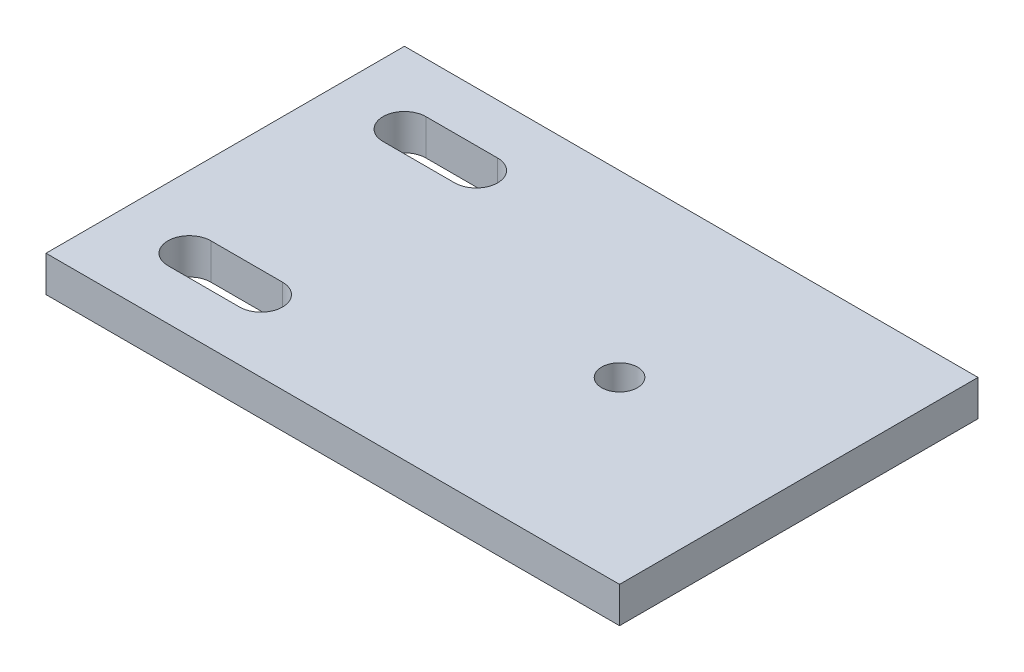
ISO-10303-21;
HEADER;
FILE_DESCRIPTION(('STEP AP214'),'2;1');
FILE_NAME('part.step','',(''),(''),'','','');
FILE_SCHEMA(('AUTOMOTIVE_DESIGN { 1 0 10303 214 1 1 1 1 }'));
ENDSEC;
DATA;
#1=APPLICATION_CONTEXT('core data for automotive mechanical design processes');
#2=APPLICATION_PROTOCOL_DEFINITION('international standard','automotive_design',2000,#1);
#3=PRODUCT_CONTEXT('',#1,'mechanical');
#4=PRODUCT('Part','Part','',(#3));
#5=PRODUCT_RELATED_PRODUCT_CATEGORY('part','',(#4));
#6=PRODUCT_DEFINITION_FORMATION('','',#4);
#7=PRODUCT_DEFINITION_CONTEXT('part definition',#1,'design');
#8=PRODUCT_DEFINITION('design','',#6,#7);
#9=PRODUCT_DEFINITION_SHAPE('','',#8);
#10=(LENGTH_UNIT() NAMED_UNIT(*) SI_UNIT(.MILLI.,.METRE.));
#11=(NAMED_UNIT(*) PLANE_ANGLE_UNIT() SI_UNIT($,.RADIAN.));
#12=(NAMED_UNIT(*) SI_UNIT($,.STERADIAN.) SOLID_ANGLE_UNIT());
#13=UNCERTAINTY_MEASURE_WITH_UNIT(LENGTH_MEASURE(1.E-05),#10,'distance_accuracy_value','');
#14=(GEOMETRIC_REPRESENTATION_CONTEXT(3) GLOBAL_UNCERTAINTY_ASSIGNED_CONTEXT((#13)) GLOBAL_UNIT_ASSIGNED_CONTEXT((#10,
#11,#12)) REPRESENTATION_CONTEXT('',''));
#15=CARTESIAN_POINT('',(0.,0.,0.));
#16=DIRECTION('',(0.,0.,1.));
#17=DIRECTION('',(1.,0.,0.));
#18=AXIS2_PLACEMENT_3D('',#15,#16,#17);
#19=CARTESIAN_POINT('',(0.,5.,0.));
#20=DIRECTION('',(0.,-1.,0.));
#21=DIRECTION('',(0.,0.,-1.));
#22=AXIS2_PLACEMENT_3D('',#19,#20,#21);
#23=PLANE('',#22);
#24=CARTESIAN_POINT('',(10.,5.,-40.));
#25=DIRECTION('',(0.,1.,0.));
#26=DIRECTION('',(0.,0.,1.));
#27=AXIS2_PLACEMENT_3D('',#24,#25,#26);
#28=CIRCLE('',#27,3.00000000000001);
#29=CARTESIAN_POINT('',(10.,5.,-43.));
#30=VERTEX_POINT('',#29);
#31=CARTESIAN_POINT('',(10.,5.,-37.));
#32=VERTEX_POINT('',#31);
#33=EDGE_CURVE('E163',#30,#32,#28,.T.);
#34=ORIENTED_EDGE('',*,*,#33,.F.);
#35=DIRECTION('',(-1.,0.,0.));
#36=VECTOR('',#35,1.);
#37=CARTESIAN_POINT('',(10.,5.,-43.));
#38=LINE('',#37,#36);
#39=CARTESIAN_POINT('',(20.,5.,-43.));
#40=VERTEX_POINT('',#39);
#41=EDGE_CURVE('E171',#40,#30,#38,.T.);
#42=ORIENTED_EDGE('',*,*,#41,.F.);
#43=CARTESIAN_POINT('',(20.,5.,-40.));
#44=DIRECTION('',(0.,1.,0.));
#45=DIRECTION('',(0.,0.,1.));
#46=AXIS2_PLACEMENT_3D('',#43,#44,#45);
#47=CIRCLE('',#46,3.00000000000001);
#48=CARTESIAN_POINT('',(20.,5.,-37.));
#49=VERTEX_POINT('',#48);
#50=EDGE_CURVE('E168',#49,#40,#47,.T.);
#51=ORIENTED_EDGE('',*,*,#50,.F.);
#52=DIRECTION('',(1.,0.,0.));
#53=VECTOR('',#52,1.);
#54=CARTESIAN_POINT('',(10.,5.,-37.));
#55=LINE('',#54,#53);
#56=EDGE_CURVE('E165',#32,#49,#55,.T.);
#57=ORIENTED_EDGE('',*,*,#56,.F.);
#58=EDGE_LOOP('',(#34,#42,#51,#57));
#59=FACE_BOUND('',#58,.T.);
#60=DIRECTION('',(0.,0.,1.));
#61=VECTOR('',#60,1.);
#62=CARTESIAN_POINT('',(0.,5.,0.));
#63=LINE('',#62,#61);
#64=CARTESIAN_POINT('',(0.,5.,-50.));
#65=VERTEX_POINT('',#64);
#66=CARTESIAN_POINT('',(0.,5.,0.));
#67=VERTEX_POINT('',#66);
#68=EDGE_CURVE('E194',#65,#67,#63,.T.);
#69=ORIENTED_EDGE('',*,*,#68,.T.);
#70=DIRECTION('',(1.,0.,0.));
#71=VECTOR('',#70,1.);
#72=CARTESIAN_POINT('',(0.,5.,0.));
#73=LINE('',#72,#71);
#74=CARTESIAN_POINT('',(80.,5.,0.));
#75=VERTEX_POINT('',#74);
#76=EDGE_CURVE('E197',#67,#75,#73,.T.);
#77=ORIENTED_EDGE('',*,*,#76,.T.);
#78=DIRECTION('',(0.,0.,-1.));
#79=VECTOR('',#78,1.);
#80=CARTESIAN_POINT('',(80.,5.,0.));
#81=LINE('',#80,#79);
#82=CARTESIAN_POINT('',(80.,5.,-50.));
#83=VERTEX_POINT('',#82);
#84=EDGE_CURVE('E200',#75,#83,#81,.T.);
#85=ORIENTED_EDGE('',*,*,#84,.T.);
#86=DIRECTION('',(-1.,0.,0.));
#87=VECTOR('',#86,1.);
#88=CARTESIAN_POINT('',(0.,5.,-50.));
#89=LINE('',#88,#87);
#90=EDGE_CURVE('E202',#83,#65,#89,.T.);
#91=ORIENTED_EDGE('',*,*,#90,.T.);
#92=EDGE_LOOP('',(#69,#77,#85,#91));
#93=FACE_BOUND('',#92,.T.);
#94=CARTESIAN_POINT('',(10.,5.,-10.));
#95=DIRECTION('',(0.,1.,0.));
#96=DIRECTION('',(0.,0.,1.));
#97=AXIS2_PLACEMENT_3D('',#94,#95,#96);
#98=CIRCLE('',#97,3.);
#99=CARTESIAN_POINT('',(10.,5.,-13.));
#100=VERTEX_POINT('',#99);
#101=CARTESIAN_POINT('',(10.,5.,-7.));
#102=VERTEX_POINT('',#101);
#103=EDGE_CURVE('E124',#100,#102,#98,.T.);
#104=ORIENTED_EDGE('',*,*,#103,.F.);
#105=DIRECTION('',(-1.,0.,0.));
#106=VECTOR('',#105,1.);
#107=CARTESIAN_POINT('',(10.,5.,-13.));
#108=LINE('',#107,#106);
#109=CARTESIAN_POINT('',(20.,5.,-13.));
#110=VERTEX_POINT('',#109);
#111=EDGE_CURVE('E147',#110,#100,#108,.T.);
#112=ORIENTED_EDGE('',*,*,#111,.F.);
#113=CARTESIAN_POINT('',(20.,5.,-10.));
#114=DIRECTION('',(0.,1.,0.));
#115=DIRECTION('',(0.,0.,1.));
#116=AXIS2_PLACEMENT_3D('',#113,#114,#115);
#117=CIRCLE('',#116,3.);
#118=CARTESIAN_POINT('',(20.,5.,-7.));
#119=VERTEX_POINT('',#118);
#120=EDGE_CURVE('E145',#119,#110,#117,.T.);
#121=ORIENTED_EDGE('',*,*,#120,.F.);
#122=DIRECTION('',(1.,0.,0.));
#123=VECTOR('',#122,1.);
#124=CARTESIAN_POINT('',(10.,5.,-7.));
#125=LINE('',#124,#123);
#126=EDGE_CURVE('E132',#102,#119,#125,.T.);
#127=ORIENTED_EDGE('',*,*,#126,.F.);
#128=EDGE_LOOP('',(#104,#112,#121,#127));
#129=FACE_BOUND('',#128,.T.);
#130=CARTESIAN_POINT('',(55.,5.,-25.));
#131=DIRECTION('',(0.,1.,0.));
#132=DIRECTION('',(0.,0.,1.));
#133=AXIS2_PLACEMENT_3D('',#130,#131,#132);
#134=CIRCLE('',#133,2.5);
#135=CARTESIAN_POINT('',(55.,5.,-22.5));
#136=VERTEX_POINT('',#135);
#137=EDGE_CURVE('E153',#136,#136,#134,.T.);
#138=ORIENTED_EDGE('',*,*,#137,.F.);
#139=EDGE_LOOP('',(#138));
#140=FACE_BOUND('',#139,.T.);
#141=ADVANCED_FACE('F35',(#59,#93,#129,#140),#23,.F.);
#142=CARTESIAN_POINT('',(0.,0.,0.));
#143=DIRECTION('',(0.,-1.,0.));
#144=DIRECTION('',(0.,0.,-1.));
#145=AXIS2_PLACEMENT_3D('',#142,#143,#144);
#146=PLANE('',#145);
#147=DIRECTION('',(-1.,0.,0.));
#148=VECTOR('',#147,1.);
#149=CARTESIAN_POINT('',(10.,0.,-13.));
#150=LINE('',#149,#148);
#151=CARTESIAN_POINT('',(20.,0.,-13.));
#152=VERTEX_POINT('',#151);
#153=CARTESIAN_POINT('',(10.,0.,-13.));
#154=VERTEX_POINT('',#153);
#155=EDGE_CURVE('E133',#152,#154,#150,.T.);
#156=ORIENTED_EDGE('',*,*,#155,.T.);
#157=CARTESIAN_POINT('',(10.,0.,-10.));
#158=DIRECTION('',(0.,1.,0.));
#159=DIRECTION('',(0.,0.,1.));
#160=AXIS2_PLACEMENT_3D('',#157,#158,#159);
#161=CIRCLE('',#160,3.);
#162=CARTESIAN_POINT('',(10.,0.,-7.));
#163=VERTEX_POINT('',#162);
#164=EDGE_CURVE('E58',#154,#163,#161,.T.);
#165=ORIENTED_EDGE('',*,*,#164,.T.);
#166=DIRECTION('',(1.,0.,0.));
#167=VECTOR('',#166,1.);
#168=CARTESIAN_POINT('',(10.,0.,-7.));
#169=LINE('',#168,#167);
#170=CARTESIAN_POINT('',(20.,0.,-7.));
#171=VERTEX_POINT('',#170);
#172=EDGE_CURVE('E139',#163,#171,#169,.T.);
#173=ORIENTED_EDGE('',*,*,#172,.T.);
#174=CARTESIAN_POINT('',(20.,0.,-10.));
#175=DIRECTION('',(0.,1.,0.));
#176=DIRECTION('',(0.,0.,1.));
#177=AXIS2_PLACEMENT_3D('',#174,#175,#176);
#178=CIRCLE('',#177,3.);
#179=EDGE_CURVE('E155',#171,#152,#178,.T.);
#180=ORIENTED_EDGE('',*,*,#179,.T.);
#181=EDGE_LOOP('',(#156,#165,#173,#180));
#182=FACE_BOUND('',#181,.T.);
#183=DIRECTION('',(-1.,0.,0.));
#184=VECTOR('',#183,1.);
#185=CARTESIAN_POINT('',(10.,0.,-43.));
#186=LINE('',#185,#184);
#187=CARTESIAN_POINT('',(20.,0.,-43.));
#188=VERTEX_POINT('',#187);
#189=CARTESIAN_POINT('',(10.,0.,-43.));
#190=VERTEX_POINT('',#189);
#191=EDGE_CURVE('E166',#188,#190,#186,.T.);
#192=ORIENTED_EDGE('',*,*,#191,.T.);
#193=CARTESIAN_POINT('',(10.,0.,-40.));
#194=DIRECTION('',(0.,1.,0.));
#195=DIRECTION('',(0.,0.,1.));
#196=AXIS2_PLACEMENT_3D('',#193,#194,#195);
#197=CIRCLE('',#196,3.00000000000001);
#198=CARTESIAN_POINT('',(10.,0.,-37.));
#199=VERTEX_POINT('',#198);
#200=EDGE_CURVE('E140',#190,#199,#197,.T.);
#201=ORIENTED_EDGE('',*,*,#200,.T.);
#202=DIRECTION('',(1.,0.,0.));
#203=VECTOR('',#202,1.);
#204=CARTESIAN_POINT('',(10.,0.,-37.));
#205=LINE('',#204,#203);
#206=CARTESIAN_POINT('',(20.,0.,-37.));
#207=VERTEX_POINT('',#206);
#208=EDGE_CURVE('E176',#199,#207,#205,.T.);
#209=ORIENTED_EDGE('',*,*,#208,.T.);
#210=CARTESIAN_POINT('',(20.,0.,-40.));
#211=DIRECTION('',(0.,1.,0.));
#212=DIRECTION('',(0.,0.,1.));
#213=AXIS2_PLACEMENT_3D('',#210,#211,#212);
#214=CIRCLE('',#213,3.00000000000001);
#215=EDGE_CURVE('E179',#207,#188,#214,.T.);
#216=ORIENTED_EDGE('',*,*,#215,.T.);
#217=EDGE_LOOP('',(#192,#201,#209,#216));
#218=FACE_BOUND('',#217,.T.);
#219=DIRECTION('',(0.,0.,1.));
#220=VECTOR('',#219,1.);
#221=CARTESIAN_POINT('',(0.,0.,0.));
#222=LINE('',#221,#220);
#223=CARTESIAN_POINT('',(0.,0.,-50.));
#224=VERTEX_POINT('',#223);
#225=CARTESIAN_POINT('',(0.,0.,0.));
#226=VERTEX_POINT('',#225);
#227=EDGE_CURVE('E193',#224,#226,#222,.T.);
#228=ORIENTED_EDGE('',*,*,#227,.F.);
#229=DIRECTION('',(-1.,0.,0.));
#230=VECTOR('',#229,1.);
#231=CARTESIAN_POINT('',(0.,0.,-50.));
#232=LINE('',#231,#230);
#233=CARTESIAN_POINT('',(80.,0.,-50.));
#234=VERTEX_POINT('',#233);
#235=EDGE_CURVE('E198',#234,#224,#232,.T.);
#236=ORIENTED_EDGE('',*,*,#235,.F.);
#237=DIRECTION('',(0.,0.,-1.));
#238=VECTOR('',#237,1.);
#239=CARTESIAN_POINT('',(80.,0.,0.));
#240=LINE('',#239,#238);
#241=CARTESIAN_POINT('',(80.,0.,0.));
#242=VERTEX_POINT('',#241);
#243=EDGE_CURVE('E209',#242,#234,#240,.T.);
#244=ORIENTED_EDGE('',*,*,#243,.F.);
#245=DIRECTION('',(1.,0.,0.));
#246=VECTOR('',#245,1.);
#247=CARTESIAN_POINT('',(0.,0.,0.));
#248=LINE('',#247,#246);
#249=EDGE_CURVE('E207',#226,#242,#248,.T.);
#250=ORIENTED_EDGE('',*,*,#249,.F.);
#251=EDGE_LOOP('',(#228,#236,#244,#250));
#252=FACE_BOUND('',#251,.T.);
#253=CARTESIAN_POINT('',(55.,0.,-25.));
#254=DIRECTION('',(0.,1.,0.));
#255=DIRECTION('',(0.,0.,1.));
#256=AXIS2_PLACEMENT_3D('',#253,#254,#255);
#257=CIRCLE('',#256,2.5);
#258=CARTESIAN_POINT('',(55.,0.,-22.5));
#259=VERTEX_POINT('',#258);
#260=EDGE_CURVE('E308',#259,#259,#257,.T.);
#261=ORIENTED_EDGE('',*,*,#260,.T.);
#262=EDGE_LOOP('',(#261));
#263=FACE_BOUND('',#262,.T.);
#264=ADVANCED_FACE('F227',(#182,#218,#252,#263),#146,.T.);
#265=CARTESIAN_POINT('',(0.,5.,0.));
#266=DIRECTION('',(1.,0.,0.));
#267=DIRECTION('',(0.,0.,-1.));
#268=AXIS2_PLACEMENT_3D('',#265,#266,#267);
#269=PLANE('',#268);
#270=ORIENTED_EDGE('',*,*,#227,.T.);
#271=DIRECTION('',(0.,-1.,0.));
#272=VECTOR('',#271,1.);
#273=CARTESIAN_POINT('',(0.,5.,0.));
#274=LINE('',#273,#272);
#275=EDGE_CURVE('E11',#67,#226,#274,.T.);
#276=ORIENTED_EDGE('',*,*,#275,.F.);
#277=ORIENTED_EDGE('',*,*,#68,.F.);
#278=DIRECTION('',(0.,-1.,0.));
#279=VECTOR('',#278,1.);
#280=CARTESIAN_POINT('',(0.,5.,-50.));
#281=LINE('',#280,#279);
#282=EDGE_CURVE('E204',#65,#224,#281,.T.);
#283=ORIENTED_EDGE('',*,*,#282,.T.);
#284=EDGE_LOOP('',(#270,#276,#277,#283));
#285=FACE_BOUND('',#284,.T.);
#286=ADVANCED_FACE('F37',(#285),#269,.F.);
#287=CARTESIAN_POINT('',(0.,5.,0.));
#288=DIRECTION('',(0.,0.,-1.));
#289=DIRECTION('',(-1.,0.,0.));
#290=AXIS2_PLACEMENT_3D('',#287,#288,#289);
#291=PLANE('',#290);
#292=ORIENTED_EDGE('',*,*,#249,.T.);
#293=DIRECTION('',(0.,-1.,0.));
#294=VECTOR('',#293,1.);
#295=CARTESIAN_POINT('',(80.,5.,0.));
#296=LINE('',#295,#294);
#297=EDGE_CURVE('E43',#75,#242,#296,.T.);
#298=ORIENTED_EDGE('',*,*,#297,.F.);
#299=ORIENTED_EDGE('',*,*,#76,.F.);
#300=ORIENTED_EDGE('',*,*,#275,.T.);
#301=EDGE_LOOP('',(#292,#298,#299,#300));
#302=FACE_BOUND('',#301,.T.);
#303=ADVANCED_FACE('F237',(#302),#291,.F.);
#304=CARTESIAN_POINT('',(80.,5.,0.));
#305=DIRECTION('',(-1.,0.,0.));
#306=DIRECTION('',(0.,0.,1.));
#307=AXIS2_PLACEMENT_3D('',#304,#305,#306);
#308=PLANE('',#307);
#309=ORIENTED_EDGE('',*,*,#243,.T.);
#310=DIRECTION('',(0.,-1.,0.));
#311=VECTOR('',#310,1.);
#312=CARTESIAN_POINT('',(80.,5.,-50.));
#313=LINE('',#312,#311);
#314=EDGE_CURVE('E214',#83,#234,#313,.T.);
#315=ORIENTED_EDGE('',*,*,#314,.F.);
#316=ORIENTED_EDGE('',*,*,#84,.F.);
#317=ORIENTED_EDGE('',*,*,#297,.T.);
#318=EDGE_LOOP('',(#309,#315,#316,#317));
#319=FACE_BOUND('',#318,.T.);
#320=ADVANCED_FACE('F221',(#319),#308,.F.);
#321=CARTESIAN_POINT('',(0.,5.,-50.));
#322=DIRECTION('',(0.,0.,1.));
#323=DIRECTION('',(1.,0.,0.));
#324=AXIS2_PLACEMENT_3D('',#321,#322,#323);
#325=PLANE('',#324);
#326=ORIENTED_EDGE('',*,*,#235,.T.);
#327=ORIENTED_EDGE('',*,*,#282,.F.);
#328=ORIENTED_EDGE('',*,*,#90,.F.);
#329=ORIENTED_EDGE('',*,*,#314,.T.);
#330=EDGE_LOOP('',(#326,#327,#328,#329));
#331=FACE_BOUND('',#330,.T.);
#332=ADVANCED_FACE('F231',(#331),#325,.F.);
#333=CARTESIAN_POINT('',(10.,5.,-40.));
#334=DIRECTION('',(0.,-1.,0.));
#335=DIRECTION('',(0.,0.,-1.));
#336=AXIS2_PLACEMENT_3D('',#333,#334,#335);
#337=CYLINDRICAL_SURFACE('',#336,3.00000000000001);
#338=ORIENTED_EDGE('',*,*,#200,.F.);
#339=DIRECTION('',(0.,-1.,0.));
#340=VECTOR('',#339,1.);
#341=CARTESIAN_POINT('',(10.,5.,-43.));
#342=LINE('',#341,#340);
#343=EDGE_CURVE('E173',#30,#190,#342,.T.);
#344=ORIENTED_EDGE('',*,*,#343,.F.);
#345=ORIENTED_EDGE('',*,*,#33,.T.);
#346=DIRECTION('',(0.,-1.,0.));
#347=VECTOR('',#346,1.);
#348=CARTESIAN_POINT('',(10.,5.,-37.));
#349=LINE('',#348,#347);
#350=EDGE_CURVE('E190',#32,#199,#349,.T.);
#351=ORIENTED_EDGE('',*,*,#350,.T.);
#352=EDGE_LOOP('',(#338,#344,#345,#351));
#353=FACE_BOUND('',#352,.T.);
#354=ADVANCED_FACE('F254',(#353),#337,.F.);
#355=CARTESIAN_POINT('',(10.,5.,-37.));
#356=DIRECTION('',(0.,0.,-1.));
#357=DIRECTION('',(-1.,0.,0.));
#358=AXIS2_PLACEMENT_3D('',#355,#356,#357);
#359=PLANE('',#358);
#360=ORIENTED_EDGE('',*,*,#208,.F.);
#361=ORIENTED_EDGE('',*,*,#350,.F.);
#362=ORIENTED_EDGE('',*,*,#56,.T.);
#363=DIRECTION('',(0.,-1.,0.));
#364=VECTOR('',#363,1.);
#365=CARTESIAN_POINT('',(20.,5.,-37.));
#366=LINE('',#365,#364);
#367=EDGE_CURVE('E188',#49,#207,#366,.T.);
#368=ORIENTED_EDGE('',*,*,#367,.T.);
#369=EDGE_LOOP('',(#360,#361,#362,#368));
#370=FACE_BOUND('',#369,.T.);
#371=ADVANCED_FACE('F261',(#370),#359,.T.);
#372=CARTESIAN_POINT('',(20.,5.,-40.));
#373=DIRECTION('',(0.,-1.,0.));
#374=DIRECTION('',(0.,0.,-1.));
#375=AXIS2_PLACEMENT_3D('',#372,#373,#374);
#376=CYLINDRICAL_SURFACE('',#375,3.00000000000001);
#377=ORIENTED_EDGE('',*,*,#215,.F.);
#378=ORIENTED_EDGE('',*,*,#367,.F.);
#379=ORIENTED_EDGE('',*,*,#50,.T.);
#380=DIRECTION('',(0.,-1.,0.));
#381=VECTOR('',#380,1.);
#382=CARTESIAN_POINT('',(20.,5.,-43.));
#383=LINE('',#382,#381);
#384=EDGE_CURVE('E186',#40,#188,#383,.T.);
#385=ORIENTED_EDGE('',*,*,#384,.T.);
#386=EDGE_LOOP('',(#377,#378,#379,#385));
#387=FACE_BOUND('',#386,.T.);
#388=ADVANCED_FACE('F266',(#387),#376,.F.);
#389=CARTESIAN_POINT('',(10.,5.,-43.));
#390=DIRECTION('',(0.,0.,1.));
#391=DIRECTION('',(1.,0.,0.));
#392=AXIS2_PLACEMENT_3D('',#389,#390,#391);
#393=PLANE('',#392);
#394=ORIENTED_EDGE('',*,*,#191,.F.);
#395=ORIENTED_EDGE('',*,*,#384,.F.);
#396=ORIENTED_EDGE('',*,*,#41,.T.);
#397=ORIENTED_EDGE('',*,*,#343,.T.);
#398=EDGE_LOOP('',(#394,#395,#396,#397));
#399=FACE_BOUND('',#398,.T.);
#400=ADVANCED_FACE('F273',(#399),#393,.T.);
#401=CARTESIAN_POINT('',(10.,5.,-10.));
#402=DIRECTION('',(0.,-1.,0.));
#403=DIRECTION('',(0.,0.,-1.));
#404=AXIS2_PLACEMENT_3D('',#401,#402,#403);
#405=CYLINDRICAL_SURFACE('',#404,3.);
#406=ORIENTED_EDGE('',*,*,#164,.F.);
#407=DIRECTION('',(0.,-1.,0.));
#408=VECTOR('',#407,1.);
#409=CARTESIAN_POINT('',(10.,5.,-13.));
#410=LINE('',#409,#408);
#411=EDGE_CURVE('E128',#100,#154,#410,.T.);
#412=ORIENTED_EDGE('',*,*,#411,.F.);
#413=ORIENTED_EDGE('',*,*,#103,.T.);
#414=DIRECTION('',(0.,-1.,0.));
#415=VECTOR('',#414,1.);
#416=CARTESIAN_POINT('',(10.,5.,-7.));
#417=LINE('',#416,#415);
#418=EDGE_CURVE('E127',#102,#163,#417,.T.);
#419=ORIENTED_EDGE('',*,*,#418,.T.);
#420=EDGE_LOOP('',(#406,#412,#413,#419));
#421=FACE_BOUND('',#420,.T.);
#422=ADVANCED_FACE('F126',(#421),#405,.F.);
#423=CARTESIAN_POINT('',(10.,5.,-7.));
#424=DIRECTION('',(0.,0.,-1.));
#425=DIRECTION('',(-1.,0.,0.));
#426=AXIS2_PLACEMENT_3D('',#423,#424,#425);
#427=PLANE('',#426);
#428=ORIENTED_EDGE('',*,*,#172,.F.);
#429=ORIENTED_EDGE('',*,*,#418,.F.);
#430=ORIENTED_EDGE('',*,*,#126,.T.);
#431=DIRECTION('',(0.,-1.,0.));
#432=VECTOR('',#431,1.);
#433=CARTESIAN_POINT('',(20.,5.,-7.));
#434=LINE('',#433,#432);
#435=EDGE_CURVE('E141',#119,#171,#434,.T.);
#436=ORIENTED_EDGE('',*,*,#435,.T.);
#437=EDGE_LOOP('',(#428,#429,#430,#436));
#438=FACE_BOUND('',#437,.T.);
#439=ADVANCED_FACE('F136',(#438),#427,.T.);
#440=CARTESIAN_POINT('',(20.,5.,-10.));
#441=DIRECTION('',(0.,-1.,0.));
#442=DIRECTION('',(0.,0.,-1.));
#443=AXIS2_PLACEMENT_3D('',#440,#441,#442);
#444=CYLINDRICAL_SURFACE('',#443,3.);
#445=ORIENTED_EDGE('',*,*,#179,.F.);
#446=ORIENTED_EDGE('',*,*,#435,.F.);
#447=ORIENTED_EDGE('',*,*,#120,.T.);
#448=DIRECTION('',(0.,-1.,0.));
#449=VECTOR('',#448,1.);
#450=CARTESIAN_POINT('',(20.,5.,-13.));
#451=LINE('',#450,#449);
#452=EDGE_CURVE('E50',#110,#152,#451,.T.);
#453=ORIENTED_EDGE('',*,*,#452,.T.);
#454=EDGE_LOOP('',(#445,#446,#447,#453));
#455=FACE_BOUND('',#454,.T.);
#456=ADVANCED_FACE('F291',(#455),#444,.F.);
#457=CARTESIAN_POINT('',(10.,5.,-13.));
#458=DIRECTION('',(0.,0.,1.));
#459=DIRECTION('',(1.,0.,0.));
#460=AXIS2_PLACEMENT_3D('',#457,#458,#459);
#461=PLANE('',#460);
#462=ORIENTED_EDGE('',*,*,#155,.F.);
#463=ORIENTED_EDGE('',*,*,#452,.F.);
#464=ORIENTED_EDGE('',*,*,#111,.T.);
#465=ORIENTED_EDGE('',*,*,#411,.T.);
#466=EDGE_LOOP('',(#462,#463,#464,#465));
#467=FACE_BOUND('',#466,.T.);
#468=ADVANCED_FACE('F294',(#467),#461,.T.);
#469=CARTESIAN_POINT('',(55.,5.,-25.));
#470=DIRECTION('',(0.,-1.,0.));
#471=DIRECTION('',(0.,0.,-1.));
#472=AXIS2_PLACEMENT_3D('',#469,#470,#471);
#473=CYLINDRICAL_SURFACE('',#472,2.5);
#474=ORIENTED_EDGE('',*,*,#137,.T.);
#475=EDGE_LOOP('',(#474));
#476=FACE_BOUND('',#475,.T.);
#477=ORIENTED_EDGE('',*,*,#260,.F.);
#478=EDGE_LOOP('',(#477));
#479=FACE_BOUND('',#478,.T.);
#480=ADVANCED_FACE('F298',(#476,#479),#473,.F.);
#481=CLOSED_SHELL('',(#141,#264,#286,#303,#320,#332,#354,#371,#388,#400,#422,#439,#456,#468,#480));
#482=MANIFOLD_SOLID_BREP('B2',#481);
#483=ADVANCED_BREP_SHAPE_REPRESENTATION('',(#18,#482),#14);
#484=SHAPE_DEFINITION_REPRESENTATION(#9,#483);
ENDSEC;
END-ISO-10303-21;
